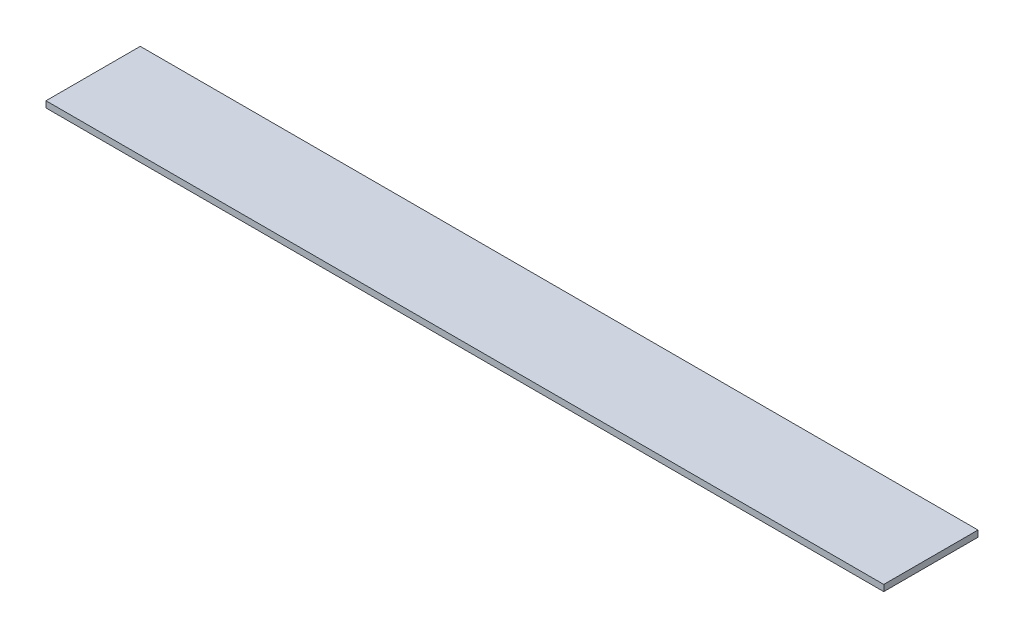
ISO-10303-21;
HEADER;
FILE_DESCRIPTION(('STEP AP214'),'2;1');
FILE_NAME('part.step','',(''),(''),'','','');
FILE_SCHEMA(('AUTOMOTIVE_DESIGN { 1 0 10303 214 1 1 1 1 }'));
ENDSEC;
DATA;
#1=APPLICATION_CONTEXT('core data for automotive mechanical design processes');
#2=APPLICATION_PROTOCOL_DEFINITION('international standard','automotive_design',2000,#1);
#3=PRODUCT_CONTEXT('',#1,'mechanical');
#4=PRODUCT('Part','Part','',(#3));
#5=PRODUCT_RELATED_PRODUCT_CATEGORY('part','',(#4));
#6=PRODUCT_DEFINITION_FORMATION('','',#4);
#7=PRODUCT_DEFINITION_CONTEXT('part definition',#1,'design');
#8=PRODUCT_DEFINITION('design','',#6,#7);
#9=PRODUCT_DEFINITION_SHAPE('','',#8);
#10=(LENGTH_UNIT() NAMED_UNIT(*) SI_UNIT(.MILLI.,.METRE.));
#11=(NAMED_UNIT(*) PLANE_ANGLE_UNIT() SI_UNIT($,.RADIAN.));
#12=(NAMED_UNIT(*) SI_UNIT($,.STERADIAN.) SOLID_ANGLE_UNIT());
#13=UNCERTAINTY_MEASURE_WITH_UNIT(LENGTH_MEASURE(1.E-05),#10,'distance_accuracy_value','');
#14=(GEOMETRIC_REPRESENTATION_CONTEXT(3) GLOBAL_UNCERTAINTY_ASSIGNED_CONTEXT((#13)) GLOBAL_UNIT_ASSIGNED_CONTEXT((#10,
#11,#12)) REPRESENTATION_CONTEXT('',''));
#15=CARTESIAN_POINT('',(0.,0.,0.));
#16=DIRECTION('',(0.,0.,1.));
#17=DIRECTION('',(1.,0.,0.));
#18=AXIS2_PLACEMENT_3D('',#15,#16,#17);
#19=CARTESIAN_POINT('',(-70.3609605089149,3.,-49.9001383211566));
#20=DIRECTION('',(1.,0.,0.));
#21=DIRECTION('',(0.,0.,-1.));
#22=AXIS2_PLACEMENT_3D('',#19,#20,#21);
#23=PLANE('',#22);
#24=DIRECTION('',(0.,0.,1.));
#25=VECTOR('',#24,1.);
#26=CARTESIAN_POINT('',(-70.3609605089149,0.,-49.9001383211566));
#27=LINE('',#26,#25);
#28=CARTESIAN_POINT('',(-70.3609605089149,0.,-49.9001383211566));
#29=VERTEX_POINT('',#28);
#30=CARTESIAN_POINT('',(-70.3609605089149,0.,-4.90013832115657));
#31=VERTEX_POINT('',#30);
#32=EDGE_CURVE('E99',#29,#31,#27,.T.);
#33=ORIENTED_EDGE('',*,*,#32,.T.);
#34=DIRECTION('',(0.,-1.,0.));
#35=VECTOR('',#34,1.);
#36=CARTESIAN_POINT('',(-70.3609605089149,3.,-4.90013832115657));
#37=LINE('',#36,#35);
#38=CARTESIAN_POINT('',(-70.3609605089149,3.,-4.90013832115657));
#39=VERTEX_POINT('',#38);
#40=EDGE_CURVE('E11',#39,#31,#37,.T.);
#41=ORIENTED_EDGE('',*,*,#40,.F.);
#42=DIRECTION('',(0.,0.,1.));
#43=VECTOR('',#42,1.);
#44=CARTESIAN_POINT('',(-70.3609605089149,3.,-49.9001383211566));
#45=LINE('',#44,#43);
#46=CARTESIAN_POINT('',(-70.3609605089149,3.,-49.9001383211566));
#47=VERTEX_POINT('',#46);
#48=EDGE_CURVE('E87',#47,#39,#45,.T.);
#49=ORIENTED_EDGE('',*,*,#48,.F.);
#50=DIRECTION('',(0.,-1.,0.));
#51=VECTOR('',#50,1.);
#52=CARTESIAN_POINT('',(-70.3609605089149,3.,-49.9001383211566));
#53=LINE('',#52,#51);
#54=EDGE_CURVE('E95',#47,#29,#53,.T.);
#55=ORIENTED_EDGE('',*,*,#54,.T.);
#56=EDGE_LOOP('',(#33,#41,#49,#55));
#57=FACE_BOUND('',#56,.T.);
#58=ADVANCED_FACE('F36',(#57),#23,.F.);
#59=CARTESIAN_POINT('',(-70.3609605089149,3.,-4.90013832115657));
#60=DIRECTION('',(0.,0.,-1.));
#61=DIRECTION('',(-1.,0.,0.));
#62=AXIS2_PLACEMENT_3D('',#59,#60,#61);
#63=PLANE('',#62);
#64=DIRECTION('',(1.,0.,0.));
#65=VECTOR('',#64,1.);
#66=CARTESIAN_POINT('',(-70.3609605089149,0.,-4.90013832115657));
#67=LINE('',#66,#65);
#68=CARTESIAN_POINT('',(329.639039491085,0.,-4.90013832115657));
#69=VERTEX_POINT('',#68);
#70=EDGE_CURVE('E91',#31,#69,#67,.T.);
#71=ORIENTED_EDGE('',*,*,#70,.T.);
#72=DIRECTION('',(0.,-1.,0.));
#73=VECTOR('',#72,1.);
#74=CARTESIAN_POINT('',(329.639039491085,3.,-4.90013832115657));
#75=LINE('',#74,#73);
#76=CARTESIAN_POINT('',(329.639039491085,3.,-4.90013832115657));
#77=VERTEX_POINT('',#76);
#78=EDGE_CURVE('E44',#77,#69,#75,.T.);
#79=ORIENTED_EDGE('',*,*,#78,.F.);
#80=DIRECTION('',(1.,0.,0.));
#81=VECTOR('',#80,1.);
#82=CARTESIAN_POINT('',(-70.3609605089149,3.,-4.90013832115657));
#83=LINE('',#82,#81);
#84=EDGE_CURVE('E82',#39,#77,#83,.T.);
#85=ORIENTED_EDGE('',*,*,#84,.F.);
#86=ORIENTED_EDGE('',*,*,#40,.T.);
#87=EDGE_LOOP('',(#71,#79,#85,#86));
#88=FACE_BOUND('',#87,.T.);
#89=ADVANCED_FACE('F90',(#88),#63,.F.);
#90=CARTESIAN_POINT('',(329.639039491085,3.,-49.9001383211566));
#91=DIRECTION('',(-1.,0.,0.));
#92=DIRECTION('',(0.,0.,1.));
#93=AXIS2_PLACEMENT_3D('',#90,#91,#92);
#94=PLANE('',#93);
#95=DIRECTION('',(0.,0.,-1.));
#96=VECTOR('',#95,1.);
#97=CARTESIAN_POINT('',(329.639039491085,0.,-49.9001383211566));
#98=LINE('',#97,#96);
#99=CARTESIAN_POINT('',(329.639039491085,0.,-49.9001383211566));
#100=VERTEX_POINT('',#99);
#101=EDGE_CURVE('E69',#69,#100,#98,.T.);
#102=ORIENTED_EDGE('',*,*,#101,.T.);
#103=DIRECTION('',(0.,-1.,0.));
#104=VECTOR('',#103,1.);
#105=CARTESIAN_POINT('',(329.639039491085,3.,-49.9001383211566));
#106=LINE('',#105,#104);
#107=CARTESIAN_POINT('',(329.639039491085,3.,-49.9001383211566));
#108=VERTEX_POINT('',#107);
#109=EDGE_CURVE('E92',#108,#100,#106,.T.);
#110=ORIENTED_EDGE('',*,*,#109,.F.);
#111=DIRECTION('',(0.,0.,-1.));
#112=VECTOR('',#111,1.);
#113=CARTESIAN_POINT('',(329.639039491085,3.,-49.9001383211566));
#114=LINE('',#113,#112);
#115=EDGE_CURVE('E85',#77,#108,#114,.T.);
#116=ORIENTED_EDGE('',*,*,#115,.F.);
#117=ORIENTED_EDGE('',*,*,#78,.T.);
#118=EDGE_LOOP('',(#102,#110,#116,#117));
#119=FACE_BOUND('',#118,.T.);
#120=ADVANCED_FACE('F93',(#119),#94,.F.);
#121=CARTESIAN_POINT('',(-70.3609605089149,3.,-49.9001383211566));
#122=DIRECTION('',(0.,0.,1.));
#123=DIRECTION('',(1.,0.,0.));
#124=AXIS2_PLACEMENT_3D('',#121,#122,#123);
#125=PLANE('',#124);
#126=DIRECTION('',(-1.,0.,0.));
#127=VECTOR('',#126,1.);
#128=CARTESIAN_POINT('',(-70.3609605089149,0.,-49.9001383211566));
#129=LINE('',#128,#127);
#130=EDGE_CURVE('E75',#100,#29,#129,.T.);
#131=ORIENTED_EDGE('',*,*,#130,.T.);
#132=ORIENTED_EDGE('',*,*,#54,.F.);
#133=DIRECTION('',(-1.,0.,0.));
#134=VECTOR('',#133,1.);
#135=CARTESIAN_POINT('',(-70.3609605089149,3.,-49.9001383211566));
#136=LINE('',#135,#134);
#137=EDGE_CURVE('E52',#108,#47,#136,.T.);
#138=ORIENTED_EDGE('',*,*,#137,.F.);
#139=ORIENTED_EDGE('',*,*,#109,.T.);
#140=EDGE_LOOP('',(#131,#132,#138,#139));
#141=FACE_BOUND('',#140,.T.);
#142=ADVANCED_FACE('F106',(#141),#125,.F.);
#143=CARTESIAN_POINT('',(0.,3.,0.));
#144=DIRECTION('',(0.,1.,0.));
#145=DIRECTION('',(0.,0.,1.));
#146=AXIS2_PLACEMENT_3D('',#143,#144,#145);
#147=PLANE('',#146);
#148=ORIENTED_EDGE('',*,*,#48,.T.);
#149=ORIENTED_EDGE('',*,*,#84,.T.);
#150=ORIENTED_EDGE('',*,*,#115,.T.);
#151=ORIENTED_EDGE('',*,*,#137,.T.);
#152=EDGE_LOOP('',(#148,#149,#150,#151));
#153=FACE_BOUND('',#152,.T.);
#154=ADVANCED_FACE('F83',(#153),#147,.T.);
#155=CARTESIAN_POINT('',(0.,0.,0.));
#156=DIRECTION('',(0.,1.,0.));
#157=DIRECTION('',(0.,0.,1.));
#158=AXIS2_PLACEMENT_3D('',#155,#156,#157);
#159=PLANE('',#158);
#160=ORIENTED_EDGE('',*,*,#32,.F.);
#161=ORIENTED_EDGE('',*,*,#130,.F.);
#162=ORIENTED_EDGE('',*,*,#101,.F.);
#163=ORIENTED_EDGE('',*,*,#70,.F.);
#164=EDGE_LOOP('',(#160,#161,#162,#163));
#165=FACE_BOUND('',#164,.T.);
#166=ADVANCED_FACE('F109',(#165),#159,.F.);
#167=CLOSED_SHELL('',(#58,#89,#120,#142,#154,#166));
#168=MANIFOLD_SOLID_BREP('B2',#167);
#169=ADVANCED_BREP_SHAPE_REPRESENTATION('',(#18,#168),#14);
#170=SHAPE_DEFINITION_REPRESENTATION(#9,#169);
ENDSEC;
END-ISO-10303-21;
